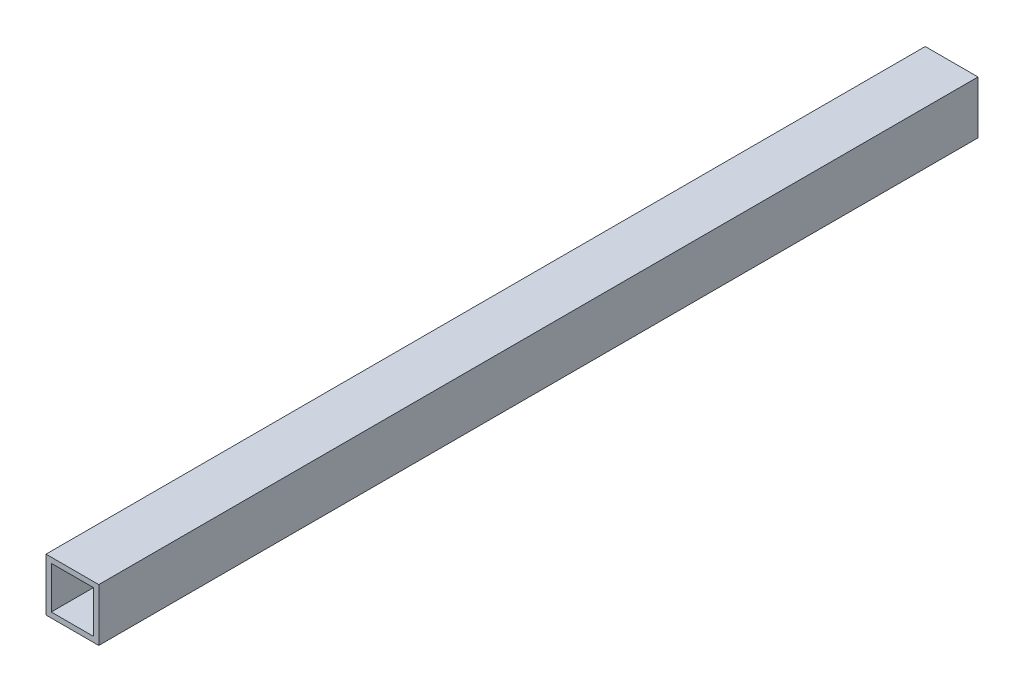
ISO-10303-21;
HEADER;
FILE_DESCRIPTION(('STEP AP214'),'2;1');
FILE_NAME('part.step','',(''),(''),'','','');
FILE_SCHEMA(('AUTOMOTIVE_DESIGN { 1 0 10303 214 1 1 1 1 }'));
ENDSEC;
DATA;
#1=APPLICATION_CONTEXT('core data for automotive mechanical design processes');
#2=APPLICATION_PROTOCOL_DEFINITION('international standard','automotive_design',2000,#1);
#3=PRODUCT_CONTEXT('',#1,'mechanical');
#4=PRODUCT('Part','Part','',(#3));
#5=PRODUCT_RELATED_PRODUCT_CATEGORY('part','',(#4));
#6=PRODUCT_DEFINITION_FORMATION('','',#4);
#7=PRODUCT_DEFINITION_CONTEXT('part definition',#1,'design');
#8=PRODUCT_DEFINITION('design','',#6,#7);
#9=PRODUCT_DEFINITION_SHAPE('','',#8);
#10=(LENGTH_UNIT() NAMED_UNIT(*) SI_UNIT(.MILLI.,.METRE.));
#11=(NAMED_UNIT(*) PLANE_ANGLE_UNIT() SI_UNIT($,.RADIAN.));
#12=(NAMED_UNIT(*) SI_UNIT($,.STERADIAN.) SOLID_ANGLE_UNIT());
#13=UNCERTAINTY_MEASURE_WITH_UNIT(LENGTH_MEASURE(1.E-05),#10,'distance_accuracy_value','');
#14=(GEOMETRIC_REPRESENTATION_CONTEXT(3) GLOBAL_UNCERTAINTY_ASSIGNED_CONTEXT((#13)) GLOBAL_UNIT_ASSIGNED_CONTEXT((#10,
#11,#12)) REPRESENTATION_CONTEXT('',''));
#15=CARTESIAN_POINT('',(0.,0.,0.));
#16=DIRECTION('',(0.,0.,1.));
#17=DIRECTION('',(1.,0.,0.));
#18=AXIS2_PLACEMENT_3D('',#15,#16,#17);
#19=CARTESIAN_POINT('',(0.,0.,250.));
#20=DIRECTION('',(0.,0.,1.));
#21=DIRECTION('',(1.,0.,0.));
#22=AXIS2_PLACEMENT_3D('',#19,#20,#21);
#23=PLANE('',#22);
#24=DIRECTION('',(0.,1.,0.));
#25=VECTOR('',#24,1.);
#26=CARTESIAN_POINT('',(7.5,6.,250.));
#27=LINE('',#26,#25);
#28=CARTESIAN_POINT('',(7.5,-7.5,250.));
#29=VERTEX_POINT('',#28);
#30=CARTESIAN_POINT('',(7.5,7.5,250.));
#31=VERTEX_POINT('',#30);
#32=EDGE_CURVE('E158',#29,#31,#27,.T.);
#33=ORIENTED_EDGE('',*,*,#32,.T.);
#34=DIRECTION('',(-1.,0.,0.));
#35=VECTOR('',#34,1.);
#36=CARTESIAN_POINT('',(-6.,7.5,250.));
#37=LINE('',#36,#35);
#38=CARTESIAN_POINT('',(-7.5,7.5,250.));
#39=VERTEX_POINT('',#38);
#40=EDGE_CURVE('E161',#31,#39,#37,.T.);
#41=ORIENTED_EDGE('',*,*,#40,.T.);
#42=DIRECTION('',(0.,-1.,0.));
#43=VECTOR('',#42,1.);
#44=CARTESIAN_POINT('',(-7.5,6.,250.));
#45=LINE('',#44,#43);
#46=CARTESIAN_POINT('',(-7.5,-7.5,250.));
#47=VERTEX_POINT('',#46);
#48=EDGE_CURVE('E164',#39,#47,#45,.T.);
#49=ORIENTED_EDGE('',*,*,#48,.T.);
#50=DIRECTION('',(1.,0.,0.));
#51=VECTOR('',#50,1.);
#52=CARTESIAN_POINT('',(-6.,-7.5,250.));
#53=LINE('',#52,#51);
#54=EDGE_CURVE('E166',#47,#29,#53,.T.);
#55=ORIENTED_EDGE('',*,*,#54,.T.);
#56=EDGE_LOOP('',(#33,#41,#49,#55));
#57=FACE_BOUND('',#56,.T.);
#58=DIRECTION('',(-1.,0.,0.));
#59=VECTOR('',#58,1.);
#60=CARTESIAN_POINT('',(-6.,6.,250.));
#61=LINE('',#60,#59);
#62=CARTESIAN_POINT('',(6.,6.,250.));
#63=VERTEX_POINT('',#62);
#64=CARTESIAN_POINT('',(-6.,6.,250.));
#65=VERTEX_POINT('',#64);
#66=EDGE_CURVE('E130',#63,#65,#61,.T.);
#67=ORIENTED_EDGE('',*,*,#66,.F.);
#68=DIRECTION('',(0.,1.,0.));
#69=VECTOR('',#68,1.);
#70=CARTESIAN_POINT('',(6.,6.,250.));
#71=LINE('',#70,#69);
#72=CARTESIAN_POINT('',(6.,-6.,250.));
#73=VERTEX_POINT('',#72);
#74=EDGE_CURVE('E122',#73,#63,#71,.T.);
#75=ORIENTED_EDGE('',*,*,#74,.F.);
#76=DIRECTION('',(1.,0.,0.));
#77=VECTOR('',#76,1.);
#78=CARTESIAN_POINT('',(-6.,-6.,250.));
#79=LINE('',#78,#77);
#80=CARTESIAN_POINT('',(-6.,-6.,250.));
#81=VERTEX_POINT('',#80);
#82=EDGE_CURVE('E144',#81,#73,#79,.T.);
#83=ORIENTED_EDGE('',*,*,#82,.F.);
#84=DIRECTION('',(0.,-1.,0.));
#85=VECTOR('',#84,1.);
#86=CARTESIAN_POINT('',(-6.,6.,250.));
#87=LINE('',#86,#85);
#88=EDGE_CURVE('E142',#65,#81,#87,.T.);
#89=ORIENTED_EDGE('',*,*,#88,.F.);
#90=EDGE_LOOP('',(#67,#75,#83,#89));
#91=FACE_BOUND('',#90,.T.);
#92=ADVANCED_FACE('F57',(#57,#91),#23,.T.);
#93=CARTESIAN_POINT('',(0.,0.,0.));
#94=DIRECTION('',(0.,0.,1.));
#95=DIRECTION('',(1.,0.,0.));
#96=AXIS2_PLACEMENT_3D('',#93,#94,#95);
#97=PLANE('',#96);
#98=DIRECTION('',(0.,1.,0.));
#99=VECTOR('',#98,1.);
#100=CARTESIAN_POINT('',(7.5,6.,0.));
#101=LINE('',#100,#99);
#102=CARTESIAN_POINT('',(7.5,-7.5,0.));
#103=VERTEX_POINT('',#102);
#104=CARTESIAN_POINT('',(7.5,7.5,0.));
#105=VERTEX_POINT('',#104);
#106=EDGE_CURVE('E138',#103,#105,#101,.T.);
#107=ORIENTED_EDGE('',*,*,#106,.F.);
#108=DIRECTION('',(1.,0.,0.));
#109=VECTOR('',#108,1.);
#110=CARTESIAN_POINT('',(-6.,-7.5,0.));
#111=LINE('',#110,#109);
#112=CARTESIAN_POINT('',(-7.5,-7.5,0.));
#113=VERTEX_POINT('',#112);
#114=EDGE_CURVE('E162',#113,#103,#111,.T.);
#115=ORIENTED_EDGE('',*,*,#114,.F.);
#116=DIRECTION('',(0.,-1.,0.));
#117=VECTOR('',#116,1.);
#118=CARTESIAN_POINT('',(-7.5,6.,0.));
#119=LINE('',#118,#117);
#120=CARTESIAN_POINT('',(-7.5,7.5,0.));
#121=VERTEX_POINT('',#120);
#122=EDGE_CURVE('E173',#121,#113,#119,.T.);
#123=ORIENTED_EDGE('',*,*,#122,.F.);
#124=DIRECTION('',(-1.,0.,0.));
#125=VECTOR('',#124,1.);
#126=CARTESIAN_POINT('',(-6.,7.5,0.));
#127=LINE('',#126,#125);
#128=EDGE_CURVE('E171',#105,#121,#127,.T.);
#129=ORIENTED_EDGE('',*,*,#128,.F.);
#130=EDGE_LOOP('',(#107,#115,#123,#129));
#131=FACE_BOUND('',#130,.T.);
#132=DIRECTION('',(0.,1.,0.));
#133=VECTOR('',#132,1.);
#134=CARTESIAN_POINT('',(6.,6.,0.));
#135=LINE('',#134,#133);
#136=CARTESIAN_POINT('',(6.,-6.,0.));
#137=VERTEX_POINT('',#136);
#138=CARTESIAN_POINT('',(6.,6.,0.));
#139=VERTEX_POINT('',#138);
#140=EDGE_CURVE('E80',#137,#139,#135,.T.);
#141=ORIENTED_EDGE('',*,*,#140,.T.);
#142=DIRECTION('',(-1.,0.,0.));
#143=VECTOR('',#142,1.);
#144=CARTESIAN_POINT('',(-6.,6.,0.));
#145=LINE('',#144,#143);
#146=CARTESIAN_POINT('',(-6.,6.,0.));
#147=VERTEX_POINT('',#146);
#148=EDGE_CURVE('E137',#139,#147,#145,.T.);
#149=ORIENTED_EDGE('',*,*,#148,.T.);
#150=DIRECTION('',(0.,-1.,0.));
#151=VECTOR('',#150,1.);
#152=CARTESIAN_POINT('',(-6.,6.,0.));
#153=LINE('',#152,#151);
#154=CARTESIAN_POINT('',(-6.,-6.,0.));
#155=VERTEX_POINT('',#154);
#156=EDGE_CURVE('E150',#147,#155,#153,.T.);
#157=ORIENTED_EDGE('',*,*,#156,.T.);
#158=DIRECTION('',(1.,0.,0.));
#159=VECTOR('',#158,1.);
#160=CARTESIAN_POINT('',(-6.,-6.,0.));
#161=LINE('',#160,#159);
#162=EDGE_CURVE('E131',#155,#137,#161,.T.);
#163=ORIENTED_EDGE('',*,*,#162,.T.);
#164=EDGE_LOOP('',(#141,#149,#157,#163));
#165=FACE_BOUND('',#164,.T.);
#166=ADVANCED_FACE('F191',(#131,#165),#97,.F.);
#167=CARTESIAN_POINT('',(7.5,6.,250.));
#168=DIRECTION('',(-1.,0.,0.));
#169=DIRECTION('',(0.,-1.,0.));
#170=AXIS2_PLACEMENT_3D('',#167,#168,#169);
#171=PLANE('',#170);
#172=ORIENTED_EDGE('',*,*,#106,.T.);
#173=DIRECTION('',(0.,0.,-1.));
#174=VECTOR('',#173,1.);
#175=CARTESIAN_POINT('',(7.5,7.5,250.));
#176=LINE('',#175,#174);
#177=EDGE_CURVE('E12',#31,#105,#176,.T.);
#178=ORIENTED_EDGE('',*,*,#177,.F.);
#179=ORIENTED_EDGE('',*,*,#32,.F.);
#180=DIRECTION('',(0.,0.,-1.));
#181=VECTOR('',#180,1.);
#182=CARTESIAN_POINT('',(7.5,-7.5,250.));
#183=LINE('',#182,#181);
#184=EDGE_CURVE('E168',#29,#103,#183,.T.);
#185=ORIENTED_EDGE('',*,*,#184,.T.);
#186=EDGE_LOOP('',(#172,#178,#179,#185));
#187=FACE_BOUND('',#186,.T.);
#188=ADVANCED_FACE('F59',(#187),#171,.F.);
#189=CARTESIAN_POINT('',(-6.,7.5,250.));
#190=DIRECTION('',(0.,-1.,0.));
#191=DIRECTION('',(0.,0.,-1.));
#192=AXIS2_PLACEMENT_3D('',#189,#190,#191);
#193=PLANE('',#192);
#194=ORIENTED_EDGE('',*,*,#128,.T.);
#195=DIRECTION('',(0.,0.,-1.));
#196=VECTOR('',#195,1.);
#197=CARTESIAN_POINT('',(-7.5,7.5,250.));
#198=LINE('',#197,#196);
#199=EDGE_CURVE('E65',#39,#121,#198,.T.);
#200=ORIENTED_EDGE('',*,*,#199,.F.);
#201=ORIENTED_EDGE('',*,*,#40,.F.);
#202=ORIENTED_EDGE('',*,*,#177,.T.);
#203=EDGE_LOOP('',(#194,#200,#201,#202));
#204=FACE_BOUND('',#203,.T.);
#205=ADVANCED_FACE('F201',(#204),#193,.F.);
#206=CARTESIAN_POINT('',(-7.5,6.,250.));
#207=DIRECTION('',(1.,0.,0.));
#208=DIRECTION('',(0.,1.,0.));
#209=AXIS2_PLACEMENT_3D('',#206,#207,#208);
#210=PLANE('',#209);
#211=ORIENTED_EDGE('',*,*,#122,.T.);
#212=DIRECTION('',(0.,0.,-1.));
#213=VECTOR('',#212,1.);
#214=CARTESIAN_POINT('',(-7.5,-7.5,250.));
#215=LINE('',#214,#213);
#216=EDGE_CURVE('E178',#47,#113,#215,.T.);
#217=ORIENTED_EDGE('',*,*,#216,.F.);
#218=ORIENTED_EDGE('',*,*,#48,.F.);
#219=ORIENTED_EDGE('',*,*,#199,.T.);
#220=EDGE_LOOP('',(#211,#217,#218,#219));
#221=FACE_BOUND('',#220,.T.);
#222=ADVANCED_FACE('F185',(#221),#210,.F.);
#223=CARTESIAN_POINT('',(-6.,-7.5,250.));
#224=DIRECTION('',(0.,1.,0.));
#225=DIRECTION('',(0.,0.,1.));
#226=AXIS2_PLACEMENT_3D('',#223,#224,#225);
#227=PLANE('',#226);
#228=ORIENTED_EDGE('',*,*,#114,.T.);
#229=ORIENTED_EDGE('',*,*,#184,.F.);
#230=ORIENTED_EDGE('',*,*,#54,.F.);
#231=ORIENTED_EDGE('',*,*,#216,.T.);
#232=EDGE_LOOP('',(#228,#229,#230,#231));
#233=FACE_BOUND('',#232,.T.);
#234=ADVANCED_FACE('F195',(#233),#227,.F.);
#235=CARTESIAN_POINT('',(6.,6.,250.));
#236=DIRECTION('',(-1.,0.,0.));
#237=DIRECTION('',(0.,-1.,0.));
#238=AXIS2_PLACEMENT_3D('',#235,#236,#237);
#239=PLANE('',#238);
#240=ORIENTED_EDGE('',*,*,#140,.F.);
#241=DIRECTION('',(0.,0.,-1.));
#242=VECTOR('',#241,1.);
#243=CARTESIAN_POINT('',(6.,-6.,250.));
#244=LINE('',#243,#242);
#245=EDGE_CURVE('E126',#73,#137,#244,.T.);
#246=ORIENTED_EDGE('',*,*,#245,.F.);
#247=ORIENTED_EDGE('',*,*,#74,.T.);
#248=DIRECTION('',(0.,0.,-1.));
#249=VECTOR('',#248,1.);
#250=CARTESIAN_POINT('',(6.,6.,250.));
#251=LINE('',#250,#249);
#252=EDGE_CURVE('E125',#63,#139,#251,.T.);
#253=ORIENTED_EDGE('',*,*,#252,.T.);
#254=EDGE_LOOP('',(#240,#246,#247,#253));
#255=FACE_BOUND('',#254,.T.);
#256=ADVANCED_FACE('F124',(#255),#239,.T.);
#257=CARTESIAN_POINT('',(-6.,6.,250.));
#258=DIRECTION('',(0.,-1.,0.));
#259=DIRECTION('',(0.,0.,-1.));
#260=AXIS2_PLACEMENT_3D('',#257,#258,#259);
#261=PLANE('',#260);
#262=ORIENTED_EDGE('',*,*,#148,.F.);
#263=ORIENTED_EDGE('',*,*,#252,.F.);
#264=ORIENTED_EDGE('',*,*,#66,.T.);
#265=DIRECTION('',(0.,0.,-1.));
#266=VECTOR('',#265,1.);
#267=CARTESIAN_POINT('',(-6.,6.,250.));
#268=LINE('',#267,#266);
#269=EDGE_CURVE('E139',#65,#147,#268,.T.);
#270=ORIENTED_EDGE('',*,*,#269,.T.);
#271=EDGE_LOOP('',(#262,#263,#264,#270));
#272=FACE_BOUND('',#271,.T.);
#273=ADVANCED_FACE('F134',(#272),#261,.T.);
#274=CARTESIAN_POINT('',(-6.,6.,250.));
#275=DIRECTION('',(1.,0.,0.));
#276=DIRECTION('',(0.,1.,0.));
#277=AXIS2_PLACEMENT_3D('',#274,#275,#276);
#278=PLANE('',#277);
#279=ORIENTED_EDGE('',*,*,#156,.F.);
#280=ORIENTED_EDGE('',*,*,#269,.F.);
#281=ORIENTED_EDGE('',*,*,#88,.T.);
#282=DIRECTION('',(0.,0.,-1.));
#283=VECTOR('',#282,1.);
#284=CARTESIAN_POINT('',(-6.,-6.,250.));
#285=LINE('',#284,#283);
#286=EDGE_CURVE('E72',#81,#155,#285,.T.);
#287=ORIENTED_EDGE('',*,*,#286,.T.);
#288=EDGE_LOOP('',(#279,#280,#281,#287));
#289=FACE_BOUND('',#288,.T.);
#290=ADVANCED_FACE('F224',(#289),#278,.T.);
#291=CARTESIAN_POINT('',(-6.,-6.,250.));
#292=DIRECTION('',(0.,1.,0.));
#293=DIRECTION('',(0.,0.,1.));
#294=AXIS2_PLACEMENT_3D('',#291,#292,#293);
#295=PLANE('',#294);
#296=ORIENTED_EDGE('',*,*,#162,.F.);
#297=ORIENTED_EDGE('',*,*,#286,.F.);
#298=ORIENTED_EDGE('',*,*,#82,.T.);
#299=ORIENTED_EDGE('',*,*,#245,.T.);
#300=EDGE_LOOP('',(#296,#297,#298,#299));
#301=FACE_BOUND('',#300,.T.);
#302=ADVANCED_FACE('F228',(#301),#295,.T.);
#303=CLOSED_SHELL('',(#92,#166,#188,#205,#222,#234,#256,#273,#290,#302));
#304=MANIFOLD_SOLID_BREP('B2',#303);
#305=ADVANCED_BREP_SHAPE_REPRESENTATION('',(#18,#304),#14);
#306=SHAPE_DEFINITION_REPRESENTATION(#9,#305);
ENDSEC;
END-ISO-10303-21;
